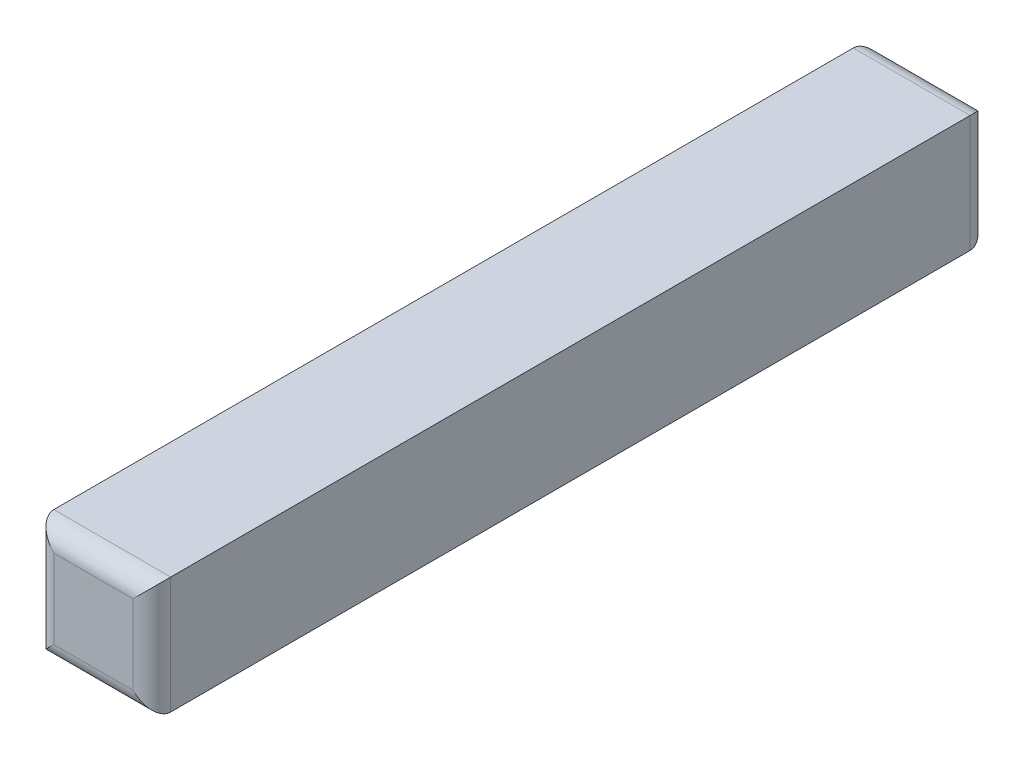
ISO-10303-21;
HEADER;
FILE_DESCRIPTION(('STEP AP214'),'2;1');
FILE_NAME('part.step','',(''),(''),'','','');
FILE_SCHEMA(('AUTOMOTIVE_DESIGN { 1 0 10303 214 1 1 1 1 }'));
ENDSEC;
DATA;
#1=APPLICATION_CONTEXT('core data for automotive mechanical design processes');
#2=APPLICATION_PROTOCOL_DEFINITION('international standard','automotive_design',2000,#1);
#3=PRODUCT_CONTEXT('',#1,'mechanical');
#4=PRODUCT('Part','Part','',(#3));
#5=PRODUCT_RELATED_PRODUCT_CATEGORY('part','',(#4));
#6=PRODUCT_DEFINITION_FORMATION('','',#4);
#7=PRODUCT_DEFINITION_CONTEXT('part definition',#1,'design');
#8=PRODUCT_DEFINITION('design','',#6,#7);
#9=PRODUCT_DEFINITION_SHAPE('','',#8);
#10=(LENGTH_UNIT() NAMED_UNIT(*) SI_UNIT(.MILLI.,.METRE.));
#11=(NAMED_UNIT(*) PLANE_ANGLE_UNIT() SI_UNIT($,.RADIAN.));
#12=(NAMED_UNIT(*) SI_UNIT($,.STERADIAN.) SOLID_ANGLE_UNIT());
#13=UNCERTAINTY_MEASURE_WITH_UNIT(LENGTH_MEASURE(1.E-05),#10,'distance_accuracy_value','');
#14=(GEOMETRIC_REPRESENTATION_CONTEXT(3) GLOBAL_UNCERTAINTY_ASSIGNED_CONTEXT((#13)) GLOBAL_UNIT_ASSIGNED_CONTEXT((#10,
#11,#12)) REPRESENTATION_CONTEXT('',''));
#15=CARTESIAN_POINT('',(0.,0.,0.));
#16=DIRECTION('',(0.,0.,1.));
#17=DIRECTION('',(1.,0.,0.));
#18=AXIS2_PLACEMENT_3D('',#15,#16,#17);
#19=CARTESIAN_POINT('',(0.,0.,4.44));
#20=DIRECTION('',(1.,0.,0.));
#21=DIRECTION('',(0.,1.,0.));
#22=AXIS2_PLACEMENT_3D('',#19,#20,#21);
#23=PLANE('',#22);
#24=DIRECTION('',(0.,0.,-1.));
#25=VECTOR('',#24,1.);
#26=CARTESIAN_POINT('',(0.,-0.62,4.44));
#27=LINE('',#26,#25);
#28=CARTESIAN_POINT('',(0.,-0.62,4.34));
#29=VERTEX_POINT('',#28);
#30=CARTESIAN_POINT('',(0.,-0.62,0.1));
#31=VERTEX_POINT('',#30);
#32=EDGE_CURVE('E118',#29,#31,#27,.T.);
#33=ORIENTED_EDGE('',*,*,#32,.F.);
#34=DIRECTION('',(0.,-1.,0.));
#35=VECTOR('',#34,1.);
#36=CARTESIAN_POINT('',(0.,0.,4.34));
#37=LINE('',#36,#35);
#38=CARTESIAN_POINT('',(0.,0.,4.34));
#39=VERTEX_POINT('',#38);
#40=EDGE_CURVE('E142',#29,#39,#37,.F.);
#41=ORIENTED_EDGE('',*,*,#40,.T.);
#42=DIRECTION('',(0.,0.,-1.));
#43=VECTOR('',#42,1.);
#44=CARTESIAN_POINT('',(0.,0.,4.44));
#45=LINE('',#44,#43);
#46=CARTESIAN_POINT('',(0.,0.,0.1));
#47=VERTEX_POINT('',#46);
#48=EDGE_CURVE('E153',#39,#47,#45,.T.);
#49=ORIENTED_EDGE('',*,*,#48,.T.);
#50=DIRECTION('',(0.,-1.,0.));
#51=VECTOR('',#50,1.);
#52=CARTESIAN_POINT('',(0.,0.,0.1));
#53=LINE('',#52,#51);
#54=EDGE_CURVE('E140',#47,#31,#53,.T.);
#55=ORIENTED_EDGE('',*,*,#54,.T.);
#56=EDGE_LOOP('',(#33,#41,#49,#55));
#57=FACE_BOUND('',#56,.T.);
#58=ADVANCED_FACE('F33',(#57),#23,.F.);
#59=CARTESIAN_POINT('',(0.,-0.62,4.44));
#60=DIRECTION('',(0.,1.,0.));
#61=DIRECTION('',(-1.,0.,0.));
#62=AXIS2_PLACEMENT_3D('',#59,#60,#61);
#63=PLANE('',#62);
#64=DIRECTION('',(0.,0.,-1.));
#65=VECTOR('',#64,1.);
#66=CARTESIAN_POINT('',(0.620000000000001,-0.62,4.44));
#67=LINE('',#66,#65);
#68=CARTESIAN_POINT('',(0.620000000000001,-0.62,4.34));
#69=VERTEX_POINT('',#68);
#70=CARTESIAN_POINT('',(0.620000000000001,-0.62,0.1));
#71=VERTEX_POINT('',#70);
#72=EDGE_CURVE('E280',#69,#71,#67,.T.);
#73=ORIENTED_EDGE('',*,*,#72,.F.);
#74=DIRECTION('',(1.,0.,0.));
#75=VECTOR('',#74,1.);
#76=CARTESIAN_POINT('',(0.,-0.62,4.34));
#77=LINE('',#76,#75);
#78=EDGE_CURVE('E138',#69,#29,#77,.F.);
#79=ORIENTED_EDGE('',*,*,#78,.T.);
#80=ORIENTED_EDGE('',*,*,#32,.T.);
#81=DIRECTION('',(1.,0.,0.));
#82=VECTOR('',#81,1.);
#83=CARTESIAN_POINT('',(0.,-0.62,0.1));
#84=LINE('',#83,#82);
#85=EDGE_CURVE('E135',#31,#71,#84,.T.);
#86=ORIENTED_EDGE('',*,*,#85,.T.);
#87=EDGE_LOOP('',(#73,#79,#80,#86));
#88=FACE_BOUND('',#87,.T.);
#89=ADVANCED_FACE('F190',(#88),#63,.F.);
#90=CARTESIAN_POINT('',(0.620000000000001,0.,4.44));
#91=DIRECTION('',(-1.,0.,0.));
#92=DIRECTION('',(0.,0.,1.));
#93=AXIS2_PLACEMENT_3D('',#90,#91,#92);
#94=PLANE('',#93);
#95=DIRECTION('',(0.,0.,-1.));
#96=VECTOR('',#95,1.);
#97=CARTESIAN_POINT('',(0.620000000000001,0.,4.44));
#98=LINE('',#97,#96);
#99=CARTESIAN_POINT('',(0.620000000000001,0.,4.34));
#100=VERTEX_POINT('',#99);
#101=CARTESIAN_POINT('',(0.620000000000001,0.,0.1));
#102=VERTEX_POINT('',#101);
#103=EDGE_CURVE('E276',#100,#102,#98,.T.);
#104=ORIENTED_EDGE('',*,*,#103,.F.);
#105=DIRECTION('',(0.,1.,0.));
#106=VECTOR('',#105,1.);
#107=CARTESIAN_POINT('',(0.620000000000001,-0.62,4.34));
#108=LINE('',#107,#106);
#109=EDGE_CURVE('E133',#100,#69,#108,.F.);
#110=ORIENTED_EDGE('',*,*,#109,.T.);
#111=ORIENTED_EDGE('',*,*,#72,.T.);
#112=DIRECTION('',(0.,1.,0.));
#113=VECTOR('',#112,1.);
#114=CARTESIAN_POINT('',(0.620000000000001,0.,0.1));
#115=LINE('',#114,#113);
#116=EDGE_CURVE('E131',#71,#102,#115,.T.);
#117=ORIENTED_EDGE('',*,*,#116,.T.);
#118=EDGE_LOOP('',(#104,#110,#111,#117));
#119=FACE_BOUND('',#118,.T.);
#120=ADVANCED_FACE('F196',(#119),#94,.F.);
#121=CARTESIAN_POINT('',(0.,0.,4.44));
#122=DIRECTION('',(0.,-1.,0.));
#123=DIRECTION('',(0.,0.,-1.));
#124=AXIS2_PLACEMENT_3D('',#121,#122,#123);
#125=PLANE('',#124);
#126=ORIENTED_EDGE('',*,*,#48,.F.);
#127=DIRECTION('',(-1.,0.,0.));
#128=VECTOR('',#127,1.);
#129=CARTESIAN_POINT('',(0.620000000000001,0.,4.34));
#130=LINE('',#129,#128);
#131=EDGE_CURVE('E105',#39,#100,#130,.F.);
#132=ORIENTED_EDGE('',*,*,#131,.T.);
#133=ORIENTED_EDGE('',*,*,#103,.T.);
#134=DIRECTION('',(-1.,0.,0.));
#135=VECTOR('',#134,1.);
#136=CARTESIAN_POINT('',(0.,0.,0.1));
#137=LINE('',#136,#135);
#138=EDGE_CURVE('E124',#102,#47,#137,.T.);
#139=ORIENTED_EDGE('',*,*,#138,.T.);
#140=EDGE_LOOP('',(#126,#132,#133,#139));
#141=FACE_BOUND('',#140,.T.);
#142=ADVANCED_FACE('F186',(#141),#125,.F.);
#143=CARTESIAN_POINT('',(0.,0.,4.44));
#144=DIRECTION('',(0.,0.,1.));
#145=DIRECTION('',(1.,0.,0.));
#146=AXIS2_PLACEMENT_3D('',#143,#144,#145);
#147=PLANE('',#146);
#148=DIRECTION('',(0.,1.,0.));
#149=VECTOR('',#148,1.);
#150=CARTESIAN_POINT('',(0.520000000000001,0.,4.44));
#151=LINE('',#150,#149);
#152=CARTESIAN_POINT('',(0.520000000000001,-0.52,4.44));
#153=VERTEX_POINT('',#152);
#154=CARTESIAN_POINT('',(0.520000000000001,-0.1,4.44));
#155=VERTEX_POINT('',#154);
#156=EDGE_CURVE('E122',#153,#155,#151,.T.);
#157=ORIENTED_EDGE('',*,*,#156,.T.);
#158=DIRECTION('',(-1.,0.,0.));
#159=VECTOR('',#158,1.);
#160=CARTESIAN_POINT('',(0.,-0.1,4.44));
#161=LINE('',#160,#159);
#162=CARTESIAN_POINT('',(0.1,-0.1,4.44));
#163=VERTEX_POINT('',#162);
#164=EDGE_CURVE('E103',#155,#163,#161,.T.);
#165=ORIENTED_EDGE('',*,*,#164,.T.);
#166=DIRECTION('',(0.,-1.,0.));
#167=VECTOR('',#166,1.);
#168=CARTESIAN_POINT('',(0.1,-0.62,4.44));
#169=LINE('',#168,#167);
#170=CARTESIAN_POINT('',(0.1,-0.52,4.44));
#171=VERTEX_POINT('',#170);
#172=EDGE_CURVE('E111',#163,#171,#169,.T.);
#173=ORIENTED_EDGE('',*,*,#172,.T.);
#174=DIRECTION('',(1.,0.,0.));
#175=VECTOR('',#174,1.);
#176=CARTESIAN_POINT('',(0.620000000000001,-0.52,4.44));
#177=LINE('',#176,#175);
#178=EDGE_CURVE('E117',#171,#153,#177,.T.);
#179=ORIENTED_EDGE('',*,*,#178,.T.);
#180=EDGE_LOOP('',(#157,#165,#173,#179));
#181=FACE_BOUND('',#180,.T.);
#182=ADVANCED_FACE('F120',(#181),#147,.T.);
#183=CARTESIAN_POINT('',(0.,0.,0.));
#184=DIRECTION('',(0.,0.,1.));
#185=DIRECTION('',(1.,0.,0.));
#186=AXIS2_PLACEMENT_3D('',#183,#184,#185);
#187=PLANE('',#186);
#188=DIRECTION('',(0.,1.,0.));
#189=VECTOR('',#188,1.);
#190=CARTESIAN_POINT('',(0.520000000000001,0.,0.));
#191=LINE('',#190,#189);
#192=CARTESIAN_POINT('',(0.520000000000001,-0.1,0.));
#193=VERTEX_POINT('',#192);
#194=CARTESIAN_POINT('',(0.520000000000001,-0.52,0.));
#195=VERTEX_POINT('',#194);
#196=EDGE_CURVE('E42',#193,#195,#191,.F.);
#197=ORIENTED_EDGE('',*,*,#196,.T.);
#198=DIRECTION('',(1.,0.,0.));
#199=VECTOR('',#198,1.);
#200=CARTESIAN_POINT('',(0.,-0.52,0.));
#201=LINE('',#200,#199);
#202=CARTESIAN_POINT('',(0.1,-0.52,0.));
#203=VERTEX_POINT('',#202);
#204=EDGE_CURVE('E11',#195,#203,#201,.F.);
#205=ORIENTED_EDGE('',*,*,#204,.T.);
#206=DIRECTION('',(0.,-1.,0.));
#207=VECTOR('',#206,1.);
#208=CARTESIAN_POINT('',(0.1,0.,0.));
#209=LINE('',#208,#207);
#210=CARTESIAN_POINT('',(0.1,-0.1,0.));
#211=VERTEX_POINT('',#210);
#212=EDGE_CURVE('E144',#203,#211,#209,.F.);
#213=ORIENTED_EDGE('',*,*,#212,.T.);
#214=DIRECTION('',(-1.,0.,0.));
#215=VECTOR('',#214,1.);
#216=CARTESIAN_POINT('',(0.,-0.1,0.));
#217=LINE('',#216,#215);
#218=EDGE_CURVE('E53',#211,#193,#217,.F.);
#219=ORIENTED_EDGE('',*,*,#218,.T.);
#220=EDGE_LOOP('',(#197,#205,#213,#219));
#221=FACE_BOUND('',#220,.T.);
#222=ADVANCED_FACE('F175',(#221),#187,.F.);
#223=CARTESIAN_POINT('',(0.,-0.52,4.34));
#224=DIRECTION('',(-1.,0.,0.));
#225=DIRECTION('',(0.,-1.,0.));
#226=AXIS2_PLACEMENT_3D('',#223,#224,#225);
#227=CYLINDRICAL_SURFACE('',#226,0.1);
#228=CARTESIAN_POINT('',(0.1,-0.52,4.34));
#229=DIRECTION('',(-0.707106781186547,0.707106781186547,0.));
#230=DIRECTION('',(0.707106781186547,0.707106781186547,0.));
#231=AXIS2_PLACEMENT_3D('',#228,#229,#230);
#232=ELLIPSE('',#231,0.14142135623731,0.1);
#233=EDGE_CURVE('E114',#29,#171,#232,.T.);
#234=ORIENTED_EDGE('',*,*,#233,.F.);
#235=ORIENTED_EDGE('',*,*,#78,.F.);
#236=CARTESIAN_POINT('',(0.520000000000001,-0.52,4.34));
#237=DIRECTION('',(-0.707106781186548,-0.707106781186547,0.));
#238=DIRECTION('',(-0.707106781186547,0.707106781186548,0.));
#239=AXIS2_PLACEMENT_3D('',#236,#237,#238);
#240=ELLIPSE('',#239,0.14142135623731,0.1);
#241=EDGE_CURVE('E150',#153,#69,#240,.F.);
#242=ORIENTED_EDGE('',*,*,#241,.F.);
#243=ORIENTED_EDGE('',*,*,#178,.F.);
#244=EDGE_LOOP('',(#234,#235,#242,#243));
#245=FACE_BOUND('',#244,.T.);
#246=ADVANCED_FACE('F177',(#245),#227,.T.);
#247=CARTESIAN_POINT('',(0.520000000000001,0.,4.34));
#248=DIRECTION('',(0.,-1.,0.));
#249=DIRECTION('',(0.,0.,-1.));
#250=AXIS2_PLACEMENT_3D('',#247,#248,#249);
#251=CYLINDRICAL_SURFACE('',#250,0.1);
#252=ORIENTED_EDGE('',*,*,#241,.T.);
#253=ORIENTED_EDGE('',*,*,#109,.F.);
#254=CARTESIAN_POINT('',(0.520000000000001,-0.1,4.34));
#255=DIRECTION('',(0.707106781186547,-0.707106781186547,0.));
#256=DIRECTION('',(-0.707106781186547,-0.707106781186547,0.));
#257=AXIS2_PLACEMENT_3D('',#254,#255,#256);
#258=ELLIPSE('',#257,0.14142135623731,0.1);
#259=EDGE_CURVE('E108',#155,#100,#258,.F.);
#260=ORIENTED_EDGE('',*,*,#259,.F.);
#261=ORIENTED_EDGE('',*,*,#156,.F.);
#262=EDGE_LOOP('',(#252,#253,#260,#261));
#263=FACE_BOUND('',#262,.T.);
#264=ADVANCED_FACE('F183',(#263),#251,.T.);
#265=CARTESIAN_POINT('',(0.1,0.,4.34));
#266=DIRECTION('',(0.,1.,0.));
#267=DIRECTION('',(-1.,0.,0.));
#268=AXIS2_PLACEMENT_3D('',#265,#266,#267);
#269=CYLINDRICAL_SURFACE('',#268,0.1);
#270=ORIENTED_EDGE('',*,*,#233,.T.);
#271=ORIENTED_EDGE('',*,*,#172,.F.);
#272=CARTESIAN_POINT('',(0.1,-0.1,4.34));
#273=DIRECTION('',(0.707106781186547,0.707106781186548,0.));
#274=DIRECTION('',(-0.707106781186548,0.707106781186547,0.));
#275=AXIS2_PLACEMENT_3D('',#272,#273,#274);
#276=ELLIPSE('',#275,0.14142135623731,0.1);
#277=EDGE_CURVE('E99',#39,#163,#276,.T.);
#278=ORIENTED_EDGE('',*,*,#277,.F.);
#279=ORIENTED_EDGE('',*,*,#40,.F.);
#280=EDGE_LOOP('',(#270,#271,#278,#279));
#281=FACE_BOUND('',#280,.T.);
#282=ADVANCED_FACE('F112',(#281),#269,.T.);
#283=CARTESIAN_POINT('',(0.,-0.1,4.34));
#284=DIRECTION('',(1.,0.,0.));
#285=DIRECTION('',(0.,0.,-1.));
#286=AXIS2_PLACEMENT_3D('',#283,#284,#285);
#287=CYLINDRICAL_SURFACE('',#286,0.1);
#288=ORIENTED_EDGE('',*,*,#259,.T.);
#289=ORIENTED_EDGE('',*,*,#131,.F.);
#290=ORIENTED_EDGE('',*,*,#277,.T.);
#291=ORIENTED_EDGE('',*,*,#164,.F.);
#292=EDGE_LOOP('',(#288,#289,#290,#291));
#293=FACE_BOUND('',#292,.T.);
#294=ADVANCED_FACE('F101',(#293),#287,.T.);
#295=CARTESIAN_POINT('',(0.,-0.1,0.1));
#296=DIRECTION('',(-1.,0.,0.));
#297=DIRECTION('',(0.,0.,1.));
#298=AXIS2_PLACEMENT_3D('',#295,#296,#297);
#299=CYLINDRICAL_SURFACE('',#298,0.1);
#300=CARTESIAN_POINT('',(0.520000000000001,-0.1,0.1));
#301=DIRECTION('',(-0.707106781186547,0.707106781186547,0.));
#302=DIRECTION('',(-0.707106781186547,-0.707106781186547,0.));
#303=AXIS2_PLACEMENT_3D('',#300,#301,#302);
#304=ELLIPSE('',#303,0.14142135623731,0.1);
#305=EDGE_CURVE('E157',#193,#102,#304,.F.);
#306=ORIENTED_EDGE('',*,*,#305,.F.);
#307=ORIENTED_EDGE('',*,*,#218,.F.);
#308=CARTESIAN_POINT('',(0.1,-0.1,0.1));
#309=DIRECTION('',(-0.707106781186547,-0.707106781186548,0.));
#310=DIRECTION('',(0.707106781186548,-0.707106781186547,0.));
#311=AXIS2_PLACEMENT_3D('',#308,#309,#310);
#312=ELLIPSE('',#311,0.14142135623731,0.1);
#313=EDGE_CURVE('E37',#47,#211,#312,.T.);
#314=ORIENTED_EDGE('',*,*,#313,.F.);
#315=ORIENTED_EDGE('',*,*,#138,.F.);
#316=EDGE_LOOP('',(#306,#307,#314,#315));
#317=FACE_BOUND('',#316,.T.);
#318=ADVANCED_FACE('F35',(#317),#299,.T.);
#319=CARTESIAN_POINT('',(0.1,0.,0.1));
#320=DIRECTION('',(0.,-1.,0.));
#321=DIRECTION('',(1.,0.,0.));
#322=AXIS2_PLACEMENT_3D('',#319,#320,#321);
#323=CYLINDRICAL_SURFACE('',#322,0.1);
#324=ORIENTED_EDGE('',*,*,#313,.T.);
#325=ORIENTED_EDGE('',*,*,#212,.F.);
#326=CARTESIAN_POINT('',(0.1,-0.52,0.1));
#327=DIRECTION('',(0.707106781186547,-0.707106781186547,0.));
#328=DIRECTION('',(-0.707106781186547,-0.707106781186547,0.));
#329=AXIS2_PLACEMENT_3D('',#326,#327,#328);
#330=ELLIPSE('',#329,0.14142135623731,0.1);
#331=EDGE_CURVE('E156',#31,#203,#330,.T.);
#332=ORIENTED_EDGE('',*,*,#331,.F.);
#333=ORIENTED_EDGE('',*,*,#54,.F.);
#334=EDGE_LOOP('',(#324,#325,#332,#333));
#335=FACE_BOUND('',#334,.T.);
#336=ADVANCED_FACE('F166',(#335),#323,.T.);
#337=CARTESIAN_POINT('',(0.520000000000001,0.,0.1));
#338=DIRECTION('',(0.,1.,0.));
#339=DIRECTION('',(0.,0.,1.));
#340=AXIS2_PLACEMENT_3D('',#337,#338,#339);
#341=CYLINDRICAL_SURFACE('',#340,0.1);
#342=ORIENTED_EDGE('',*,*,#305,.T.);
#343=ORIENTED_EDGE('',*,*,#116,.F.);
#344=CARTESIAN_POINT('',(0.520000000000001,-0.52,0.1));
#345=DIRECTION('',(0.707106781186548,0.707106781186547,0.));
#346=DIRECTION('',(-0.707106781186547,0.707106781186548,0.));
#347=AXIS2_PLACEMENT_3D('',#344,#345,#346);
#348=ELLIPSE('',#347,0.14142135623731,0.1);
#349=EDGE_CURVE('E154',#195,#71,#348,.F.);
#350=ORIENTED_EDGE('',*,*,#349,.F.);
#351=ORIENTED_EDGE('',*,*,#196,.F.);
#352=EDGE_LOOP('',(#342,#343,#350,#351));
#353=FACE_BOUND('',#352,.T.);
#354=ADVANCED_FACE('F171',(#353),#341,.T.);
#355=CARTESIAN_POINT('',(0.,-0.52,0.1));
#356=DIRECTION('',(1.,0.,0.));
#357=DIRECTION('',(0.,1.,0.));
#358=AXIS2_PLACEMENT_3D('',#355,#356,#357);
#359=CYLINDRICAL_SURFACE('',#358,0.1);
#360=ORIENTED_EDGE('',*,*,#331,.T.);
#361=ORIENTED_EDGE('',*,*,#204,.F.);
#362=ORIENTED_EDGE('',*,*,#349,.T.);
#363=ORIENTED_EDGE('',*,*,#85,.F.);
#364=EDGE_LOOP('',(#360,#361,#362,#363));
#365=FACE_BOUND('',#364,.T.);
#366=ADVANCED_FACE('F174',(#365),#359,.T.);
#367=CLOSED_SHELL('',(#58,#89,#120,#142,#182,#222,#246,#264,#282,#294,#318,#336,#354,#366));
#368=MANIFOLD_SOLID_BREP('B2',#367);
#369=ADVANCED_BREP_SHAPE_REPRESENTATION('',(#18,#368),#14);
#370=SHAPE_DEFINITION_REPRESENTATION(#9,#369);
ENDSEC;
END-ISO-10303-21;
